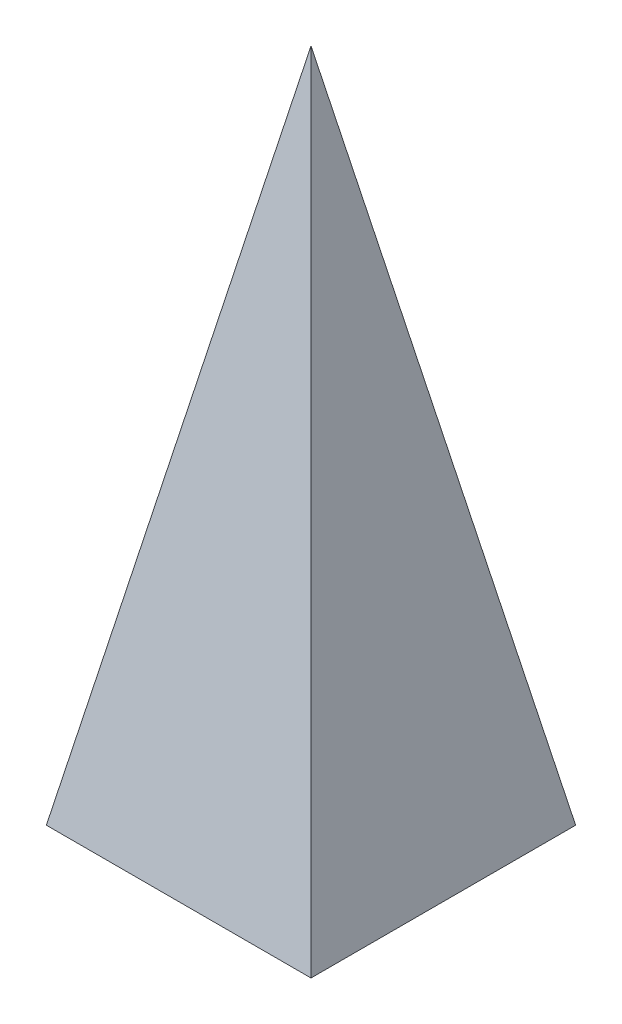
ISO-10303-21;
HEADER;
FILE_DESCRIPTION(('STEP AP214'),'2;1');
FILE_NAME('part.step','',(''),(''),'','','');
FILE_SCHEMA(('AUTOMOTIVE_DESIGN { 1 0 10303 214 1 1 1 1 }'));
ENDSEC;
DATA;
#1=APPLICATION_CONTEXT('core data for automotive mechanical design processes');
#2=APPLICATION_PROTOCOL_DEFINITION('international standard','automotive_design',2000,#1);
#3=PRODUCT_CONTEXT('',#1,'mechanical');
#4=PRODUCT('Part','Part','',(#3));
#5=PRODUCT_RELATED_PRODUCT_CATEGORY('part','',(#4));
#6=PRODUCT_DEFINITION_FORMATION('','',#4);
#7=PRODUCT_DEFINITION_CONTEXT('part definition',#1,'design');
#8=PRODUCT_DEFINITION('design','',#6,#7);
#9=PRODUCT_DEFINITION_SHAPE('','',#8);
#10=(LENGTH_UNIT() NAMED_UNIT(*) SI_UNIT(.MILLI.,.METRE.));
#11=(NAMED_UNIT(*) PLANE_ANGLE_UNIT() SI_UNIT($,.RADIAN.));
#12=(NAMED_UNIT(*) SI_UNIT($,.STERADIAN.) SOLID_ANGLE_UNIT());
#13=UNCERTAINTY_MEASURE_WITH_UNIT(LENGTH_MEASURE(1.E-05),#10,'distance_accuracy_value','');
#14=(GEOMETRIC_REPRESENTATION_CONTEXT(3) GLOBAL_UNCERTAINTY_ASSIGNED_CONTEXT((#13)) GLOBAL_UNIT_ASSIGNED_CONTEXT((#10,
#11,#12)) REPRESENTATION_CONTEXT('',''));
#15=CARTESIAN_POINT('',(0.,0.,0.));
#16=DIRECTION('',(0.,0.,1.));
#17=DIRECTION('',(1.,0.,0.));
#18=AXIS2_PLACEMENT_3D('',#15,#16,#17);
#19=CARTESIAN_POINT('',(0.,0.,0.));
#20=DIRECTION('',(0.,1.,0.));
#21=DIRECTION('',(0.,0.,1.));
#22=AXIS2_PLACEMENT_3D('',#19,#20,#21);
#23=PLANE('',#22);
#24=DIRECTION('',(0.,0.,-1.));
#25=VECTOR('',#24,1.);
#26=CARTESIAN_POINT('',(50.,0.,-50.));
#27=LINE('',#26,#25);
#28=CARTESIAN_POINT('',(50.,0.,50.));
#29=VERTEX_POINT('',#28);
#30=CARTESIAN_POINT('',(50.,0.,-50.));
#31=VERTEX_POINT('',#30);
#32=EDGE_CURVE('E128',#29,#31,#27,.T.);
#33=ORIENTED_EDGE('',*,*,#32,.F.);
#34=DIRECTION('',(1.,0.,0.));
#35=VECTOR('',#34,1.);
#36=CARTESIAN_POINT('',(-50.,0.,50.));
#37=LINE('',#36,#35);
#38=CARTESIAN_POINT('',(-50.,0.,50.));
#39=VERTEX_POINT('',#38);
#40=EDGE_CURVE('E65',#39,#29,#37,.T.);
#41=ORIENTED_EDGE('',*,*,#40,.F.);
#42=DIRECTION('',(0.,0.,1.));
#43=VECTOR('',#42,1.);
#44=CARTESIAN_POINT('',(-50.,0.,-50.));
#45=LINE('',#44,#43);
#46=CARTESIAN_POINT('',(-50.,0.,-50.));
#47=VERTEX_POINT('',#46);
#48=EDGE_CURVE('E58',#47,#39,#45,.T.);
#49=ORIENTED_EDGE('',*,*,#48,.F.);
#50=DIRECTION('',(-1.,0.,0.));
#51=VECTOR('',#50,1.);
#52=CARTESIAN_POINT('',(-50.,0.,-50.));
#53=LINE('',#52,#51);
#54=EDGE_CURVE('E82',#31,#47,#53,.T.);
#55=ORIENTED_EDGE('',*,*,#54,.F.);
#56=EDGE_LOOP('',(#33,#41,#49,#55));
#57=FACE_BOUND('',#56,.T.);
#58=ADVANCED_FACE('F38',(#57),#23,.F.);
#59=CARTESIAN_POINT('',(0.,9.44094779711219,-48.1488337652722));
#60=DIRECTION('',(0.,-0.192414460721011,0.981313749677157));
#61=DIRECTION('',(0.,-0.981313749677157,-0.192414460721011));
#62=AXIS2_PLACEMENT_3D('',#59,#60,#61);
#63=PLANE('',#62);
#64=DIRECTION('',(0.188948498713306,0.96363734343786,0.188948498713306));
#65=VECTOR('',#64,1.);
#66=CARTESIAN_POINT('',(-50.,0.,-50.));
#67=LINE('',#66,#65);
#68=CARTESIAN_POINT('',(0.,255.,0.));
#69=VERTEX_POINT('',#68);
#70=EDGE_CURVE('E76',#47,#69,#67,.T.);
#71=ORIENTED_EDGE('',*,*,#70,.T.);
#72=DIRECTION('',(-0.188948498713306,0.96363734343786,0.188948498713306));
#73=VECTOR('',#72,1.);
#74=CARTESIAN_POINT('',(50.,0.,-50.));
#75=LINE('',#74,#73);
#76=EDGE_CURVE('E81',#31,#69,#75,.T.);
#77=ORIENTED_EDGE('',*,*,#76,.F.);
#78=ORIENTED_EDGE('',*,*,#54,.T.);
#79=EDGE_LOOP('',(#71,#77,#78));
#80=FACE_BOUND('',#79,.T.);
#81=ADVANCED_FACE('F85',(#80),#63,.F.);
#82=CARTESIAN_POINT('',(48.1488337652721,9.44094779711217,0.));
#83=DIRECTION('',(-0.981313749677157,-0.192414460721011,0.));
#84=DIRECTION('',(0.192414460721011,-0.981313749677157,0.));
#85=AXIS2_PLACEMENT_3D('',#82,#83,#84);
#86=PLANE('',#85);
#87=ORIENTED_EDGE('',*,*,#76,.T.);
#88=DIRECTION('',(-0.188948498713306,0.96363734343786,-0.188948498713306));
#89=VECTOR('',#88,1.);
#90=CARTESIAN_POINT('',(50.,0.,50.));
#91=LINE('',#90,#89);
#92=EDGE_CURVE('E12',#29,#69,#91,.T.);
#93=ORIENTED_EDGE('',*,*,#92,.F.);
#94=ORIENTED_EDGE('',*,*,#32,.T.);
#95=EDGE_LOOP('',(#87,#93,#94));
#96=FACE_BOUND('',#95,.T.);
#97=ADVANCED_FACE('F133',(#96),#86,.F.);
#98=CARTESIAN_POINT('',(-48.1488337652722,9.44094779711219,0.));
#99=DIRECTION('',(0.981313749677157,-0.192414460721011,0.));
#100=DIRECTION('',(0.192414460721011,0.981313749677157,0.));
#101=AXIS2_PLACEMENT_3D('',#98,#99,#100);
#102=PLANE('',#101);
#103=DIRECTION('',(0.188948498713306,0.96363734343786,-0.188948498713306));
#104=VECTOR('',#103,1.);
#105=CARTESIAN_POINT('',(-50.,0.,50.));
#106=LINE('',#105,#104);
#107=EDGE_CURVE('E50',#39,#69,#106,.T.);
#108=ORIENTED_EDGE('',*,*,#107,.T.);
#109=ORIENTED_EDGE('',*,*,#70,.F.);
#110=ORIENTED_EDGE('',*,*,#48,.T.);
#111=EDGE_LOOP('',(#108,#109,#110));
#112=FACE_BOUND('',#111,.T.);
#113=ADVANCED_FACE('F78',(#112),#102,.F.);
#114=CARTESIAN_POINT('',(0.,9.44094779711217,48.1488337652721));
#115=DIRECTION('',(0.,-0.192414460721011,-0.981313749677157));
#116=DIRECTION('',(0.,0.981313749677157,-0.192414460721011));
#117=AXIS2_PLACEMENT_3D('',#114,#115,#116);
#118=PLANE('',#117);
#119=ORIENTED_EDGE('',*,*,#92,.T.);
#120=ORIENTED_EDGE('',*,*,#107,.F.);
#121=ORIENTED_EDGE('',*,*,#40,.T.);
#122=EDGE_LOOP('',(#119,#120,#121));
#123=FACE_BOUND('',#122,.T.);
#124=ADVANCED_FACE('F40',(#123),#118,.F.);
#125=CLOSED_SHELL('',(#58,#81,#97,#113,#124));
#126=MANIFOLD_SOLID_BREP('B2',#125);
#127=ADVANCED_BREP_SHAPE_REPRESENTATION('',(#18,#126),#14);
#128=SHAPE_DEFINITION_REPRESENTATION(#9,#127);
ENDSEC;
END-ISO-10303-21;
